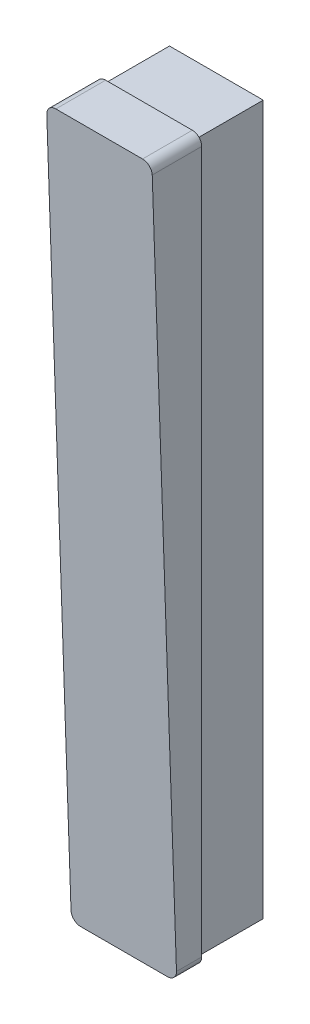
ISO-10303-21;
HEADER;
FILE_DESCRIPTION(('STEP AP214'),'2;1');
FILE_NAME('part.step','',(''),(''),'','','');
FILE_SCHEMA(('AUTOMOTIVE_DESIGN { 1 0 10303 214 1 1 1 1 }'));
ENDSEC;
DATA;
#1=APPLICATION_CONTEXT('core data for automotive mechanical design processes');
#2=APPLICATION_PROTOCOL_DEFINITION('international standard','automotive_design',2000,#1);
#3=PRODUCT_CONTEXT('',#1,'mechanical');
#4=PRODUCT('Part','Part','',(#3));
#5=PRODUCT_RELATED_PRODUCT_CATEGORY('part','',(#4));
#6=PRODUCT_DEFINITION_FORMATION('','',#4);
#7=PRODUCT_DEFINITION_CONTEXT('part definition',#1,'design');
#8=PRODUCT_DEFINITION('design','',#6,#7);
#9=PRODUCT_DEFINITION_SHAPE('','',#8);
#10=(LENGTH_UNIT() NAMED_UNIT(*) SI_UNIT(.MILLI.,.METRE.));
#11=(NAMED_UNIT(*) PLANE_ANGLE_UNIT() SI_UNIT($,.RADIAN.));
#12=(NAMED_UNIT(*) SI_UNIT($,.STERADIAN.) SOLID_ANGLE_UNIT());
#13=UNCERTAINTY_MEASURE_WITH_UNIT(LENGTH_MEASURE(1.E-05),#10,'distance_accuracy_value','');
#14=(GEOMETRIC_REPRESENTATION_CONTEXT(3) GLOBAL_UNCERTAINTY_ASSIGNED_CONTEXT((#13)) GLOBAL_UNIT_ASSIGNED_CONTEXT((#10,
#11,#12)) REPRESENTATION_CONTEXT('',''));
#15=CARTESIAN_POINT('',(0.,0.,0.));
#16=DIRECTION('',(0.,0.,1.));
#17=DIRECTION('',(1.,0.,0.));
#18=AXIS2_PLACEMENT_3D('',#15,#16,#17);
#19=CARTESIAN_POINT('',(28.575,195.2625,0.));
#20=DIRECTION('',(0.,0.,-1.));
#21=DIRECTION('',(-1.,0.,0.));
#22=AXIS2_PLACEMENT_3D('',#19,#20,#21);
#23=PLANE('',#22);
#24=DIRECTION('',(0.,-1.,0.));
#25=VECTOR('',#24,1.);
#26=CARTESIAN_POINT('',(-28.575,195.2625,0.));
#27=LINE('',#26,#25);
#28=CARTESIAN_POINT('',(-28.575,190.1825,0.));
#29=VERTEX_POINT('',#28);
#30=CARTESIAN_POINT('',(-28.575,-190.1825,0.));
#31=VERTEX_POINT('',#30);
#32=EDGE_CURVE('E207',#29,#31,#27,.T.);
#33=ORIENTED_EDGE('',*,*,#32,.F.);
#34=CARTESIAN_POINT('',(-23.495,190.1825,0.));
#35=DIRECTION('',(0.,0.,-1.));
#36=DIRECTION('',(-1.,0.,0.));
#37=AXIS2_PLACEMENT_3D('',#34,#35,#36);
#38=CIRCLE('',#37,5.08);
#39=CARTESIAN_POINT('',(-23.495,195.2625,0.));
#40=VERTEX_POINT('',#39);
#41=EDGE_CURVE('E238',#29,#40,#38,.T.);
#42=ORIENTED_EDGE('',*,*,#41,.T.);
#43=DIRECTION('',(-1.,0.,0.));
#44=VECTOR('',#43,1.);
#45=CARTESIAN_POINT('',(28.575,195.2625,0.));
#46=LINE('',#45,#44);
#47=CARTESIAN_POINT('',(23.495,195.2625,0.));
#48=VERTEX_POINT('',#47);
#49=EDGE_CURVE('E219',#48,#40,#46,.T.);
#50=ORIENTED_EDGE('',*,*,#49,.F.);
#51=CARTESIAN_POINT('',(23.495,190.1825,0.));
#52=DIRECTION('',(0.,0.,-1.));
#53=DIRECTION('',(-1.,0.,0.));
#54=AXIS2_PLACEMENT_3D('',#51,#52,#53);
#55=CIRCLE('',#54,5.08);
#56=CARTESIAN_POINT('',(28.575,190.1825,0.));
#57=VERTEX_POINT('',#56);
#58=EDGE_CURVE('E234',#48,#57,#55,.T.);
#59=ORIENTED_EDGE('',*,*,#58,.T.);
#60=DIRECTION('',(0.,-1.,0.));
#61=VECTOR('',#60,1.);
#62=CARTESIAN_POINT('',(28.575,195.2625,0.));
#63=LINE('',#62,#61);
#64=CARTESIAN_POINT('',(28.575,-190.1825,0.));
#65=VERTEX_POINT('',#64);
#66=EDGE_CURVE('E206',#57,#65,#63,.T.);
#67=ORIENTED_EDGE('',*,*,#66,.T.);
#68=CARTESIAN_POINT('',(23.495,-190.1825,0.));
#69=DIRECTION('',(0.,0.,-1.));
#70=DIRECTION('',(-1.,0.,0.));
#71=AXIS2_PLACEMENT_3D('',#68,#69,#70);
#72=CIRCLE('',#71,5.08);
#73=CARTESIAN_POINT('',(23.495,-195.2625,0.));
#74=VERTEX_POINT('',#73);
#75=EDGE_CURVE('E232',#65,#74,#72,.T.);
#76=ORIENTED_EDGE('',*,*,#75,.T.);
#77=DIRECTION('',(-1.,0.,0.));
#78=VECTOR('',#77,1.);
#79=CARTESIAN_POINT('',(28.575,-195.2625,0.));
#80=LINE('',#79,#78);
#81=CARTESIAN_POINT('',(-23.495,-195.2625,0.));
#82=VERTEX_POINT('',#81);
#83=EDGE_CURVE('E215',#74,#82,#80,.T.);
#84=ORIENTED_EDGE('',*,*,#83,.T.);
#85=CARTESIAN_POINT('',(-23.495,-190.1825,0.));
#86=DIRECTION('',(0.,0.,-1.));
#87=DIRECTION('',(-1.,0.,0.));
#88=AXIS2_PLACEMENT_3D('',#85,#86,#87);
#89=CIRCLE('',#88,5.08);
#90=EDGE_CURVE('E236',#82,#31,#89,.T.);
#91=ORIENTED_EDGE('',*,*,#90,.T.);
#92=EDGE_LOOP('',(#33,#42,#50,#59,#67,#76,#84,#91));
#93=FACE_BOUND('',#92,.T.);
#94=DIRECTION('',(1.,0.,0.));
#95=VECTOR('',#94,1.);
#96=CARTESIAN_POINT('',(25.4,192.0875,0.));
#97=LINE('',#96,#95);
#98=CARTESIAN_POINT('',(-25.4,192.0875,0.));
#99=VERTEX_POINT('',#98);
#100=CARTESIAN_POINT('',(25.4,192.0875,0.));
#101=VERTEX_POINT('',#100);
#102=EDGE_CURVE('E188',#99,#101,#97,.T.);
#103=ORIENTED_EDGE('',*,*,#102,.F.);
#104=DIRECTION('',(0.,1.,0.));
#105=VECTOR('',#104,1.);
#106=CARTESIAN_POINT('',(-25.4,192.0875,0.));
#107=LINE('',#106,#105);
#108=CARTESIAN_POINT('',(-25.4,-192.0875,0.));
#109=VERTEX_POINT('',#108);
#110=EDGE_CURVE('E174',#109,#99,#107,.T.);
#111=ORIENTED_EDGE('',*,*,#110,.F.);
#112=DIRECTION('',(-1.,0.,0.));
#113=VECTOR('',#112,1.);
#114=CARTESIAN_POINT('',(-25.4,-192.0875,0.));
#115=LINE('',#114,#113);
#116=CARTESIAN_POINT('',(25.4,-192.0875,0.));
#117=VERTEX_POINT('',#116);
#118=EDGE_CURVE('E179',#117,#109,#115,.T.);
#119=ORIENTED_EDGE('',*,*,#118,.F.);
#120=DIRECTION('',(0.,-1.,0.));
#121=VECTOR('',#120,1.);
#122=CARTESIAN_POINT('',(25.4,-192.0875,0.));
#123=LINE('',#122,#121);
#124=EDGE_CURVE('E190',#101,#117,#123,.T.);
#125=ORIENTED_EDGE('',*,*,#124,.F.);
#126=EDGE_LOOP('',(#103,#111,#119,#125));
#127=FACE_BOUND('',#126,.T.);
#128=ADVANCED_FACE('F35',(#93,#127),#23,.T.);
#129=CARTESIAN_POINT('',(28.575,-195.2625,0.));
#130=DIRECTION('',(0.,-1.,0.));
#131=DIRECTION('',(0.,0.,-1.));
#132=AXIS2_PLACEMENT_3D('',#129,#130,#131);
#133=PLANE('',#132);
#134=DIRECTION('',(-1.,0.,0.));
#135=VECTOR('',#134,1.);
#136=CARTESIAN_POINT('',(28.575,-195.2625,13.49375));
#137=LINE('',#136,#135);
#138=CARTESIAN_POINT('',(23.495,-195.2625,13.49375));
#139=VERTEX_POINT('',#138);
#140=CARTESIAN_POINT('',(-23.495,-195.2625,13.49375));
#141=VERTEX_POINT('',#140);
#142=EDGE_CURVE('E210',#139,#141,#137,.T.);
#143=ORIENTED_EDGE('',*,*,#142,.T.);
#144=DIRECTION('',(0.,0.,1.));
#145=VECTOR('',#144,1.);
#146=CARTESIAN_POINT('',(-23.495,-195.2625,0.));
#147=LINE('',#146,#145);
#148=EDGE_CURVE('E255',#141,#82,#147,.F.);
#149=ORIENTED_EDGE('',*,*,#148,.T.);
#150=ORIENTED_EDGE('',*,*,#83,.F.);
#151=DIRECTION('',(0.,0.,1.));
#152=VECTOR('',#151,1.);
#153=CARTESIAN_POINT('',(23.495,-195.2625,0.));
#154=LINE('',#153,#152);
#155=EDGE_CURVE('E252',#74,#139,#154,.T.);
#156=ORIENTED_EDGE('',*,*,#155,.T.);
#157=EDGE_LOOP('',(#143,#149,#150,#156));
#158=FACE_BOUND('',#157,.T.);
#159=ADVANCED_FACE('F267',(#158),#133,.T.);
#160=CARTESIAN_POINT('',(28.575,195.2625,26.9875));
#161=DIRECTION('',(0.,1.,0.));
#162=DIRECTION('',(0.,0.,1.));
#163=AXIS2_PLACEMENT_3D('',#160,#161,#162);
#164=PLANE('',#163);
#165=ORIENTED_EDGE('',*,*,#49,.T.);
#166=DIRECTION('',(0.,0.,-1.));
#167=VECTOR('',#166,1.);
#168=CARTESIAN_POINT('',(-23.495,195.2625,26.9875));
#169=LINE('',#168,#167);
#170=CARTESIAN_POINT('',(-23.495,195.2625,26.9875));
#171=VERTEX_POINT('',#170);
#172=EDGE_CURVE('E243',#40,#171,#169,.F.);
#173=ORIENTED_EDGE('',*,*,#172,.T.);
#174=DIRECTION('',(-1.,0.,0.));
#175=VECTOR('',#174,1.);
#176=CARTESIAN_POINT('',(28.575,195.2625,26.9875));
#177=LINE('',#176,#175);
#178=CARTESIAN_POINT('',(23.495,195.2625,26.9875));
#179=VERTEX_POINT('',#178);
#180=EDGE_CURVE('E222',#179,#171,#177,.T.);
#181=ORIENTED_EDGE('',*,*,#180,.F.);
#182=DIRECTION('',(0.,0.,-1.));
#183=VECTOR('',#182,1.);
#184=CARTESIAN_POINT('',(23.495,195.2625,26.9875));
#185=LINE('',#184,#183);
#186=EDGE_CURVE('E240',#179,#48,#185,.T.);
#187=ORIENTED_EDGE('',*,*,#186,.T.);
#188=EDGE_LOOP('',(#165,#173,#181,#187));
#189=FACE_BOUND('',#188,.T.);
#190=ADVANCED_FACE('F281',(#189),#164,.T.);
#191=CARTESIAN_POINT('',(28.575,-195.2625,13.49375));
#192=DIRECTION('',(0.,-0.0345322376732171,0.999403584424871));
#193=DIRECTION('',(0.,-0.999403584424871,-0.0345322376732171));
#194=AXIS2_PLACEMENT_3D('',#191,#192,#193);
#195=PLANE('',#194);
#196=ORIENTED_EDGE('',*,*,#180,.T.);
#197=CARTESIAN_POINT('',(-23.495,190.1825,26.8119715447154));
#198=DIRECTION('',(0.,-0.0345322376732171,0.999403584424871));
#199=DIRECTION('',(0.,0.999403584424871,0.0345322376732171));
#200=AXIS2_PLACEMENT_3D('',#197,#198,#199);
#201=ELLIPSE('',#200,5.08303159921464,5.08);
#202=CARTESIAN_POINT('',(-28.575,190.1825,26.8119715447154));
#203=VERTEX_POINT('',#202);
#204=EDGE_CURVE('E250',#171,#203,#201,.T.);
#205=ORIENTED_EDGE('',*,*,#204,.T.);
#206=DIRECTION('',(0.,0.999403584424871,0.0345322376732171));
#207=VECTOR('',#206,1.);
#208=CARTESIAN_POINT('',(-28.575,-195.2625,13.49375));
#209=LINE('',#208,#207);
#210=CARTESIAN_POINT('',(-28.575,-190.1825,13.6692784552845));
#211=VERTEX_POINT('',#210);
#212=EDGE_CURVE('E203',#211,#203,#209,.T.);
#213=ORIENTED_EDGE('',*,*,#212,.F.);
#214=CARTESIAN_POINT('',(-23.495,-190.1825,13.6692784552845));
#215=DIRECTION('',(0.,-0.0345322376732171,0.999403584424871));
#216=DIRECTION('',(0.,-0.999403584424871,-0.0345322376732171));
#217=AXIS2_PLACEMENT_3D('',#214,#215,#216);
#218=ELLIPSE('',#217,5.08303159921464,5.08);
#219=EDGE_CURVE('E248',#211,#141,#218,.T.);
#220=ORIENTED_EDGE('',*,*,#219,.T.);
#221=ORIENTED_EDGE('',*,*,#142,.F.);
#222=CARTESIAN_POINT('',(23.495,-190.1825,13.6692784552845));
#223=DIRECTION('',(0.,-0.0345322376732171,0.999403584424871));
#224=DIRECTION('',(0.,0.999403584424871,0.0345322376732171));
#225=AXIS2_PLACEMENT_3D('',#222,#223,#224);
#226=ELLIPSE('',#225,5.08303159921464,5.08);
#227=CARTESIAN_POINT('',(28.575,-190.1825,13.6692784552845));
#228=VERTEX_POINT('',#227);
#229=EDGE_CURVE('E55',#139,#228,#226,.T.);
#230=ORIENTED_EDGE('',*,*,#229,.T.);
#231=DIRECTION('',(0.,0.999403584424871,0.0345322376732171));
#232=VECTOR('',#231,1.);
#233=CARTESIAN_POINT('',(28.575,-195.2625,13.49375));
#234=LINE('',#233,#232);
#235=CARTESIAN_POINT('',(28.575,190.1825,26.8119715447154));
#236=VERTEX_POINT('',#235);
#237=EDGE_CURVE('E204',#228,#236,#234,.T.);
#238=ORIENTED_EDGE('',*,*,#237,.T.);
#239=CARTESIAN_POINT('',(23.495,190.1825,26.8119715447154));
#240=DIRECTION('',(0.,-0.0345322376732171,0.999403584424871));
#241=DIRECTION('',(0.,-0.999403584424871,-0.0345322376732171));
#242=AXIS2_PLACEMENT_3D('',#239,#240,#241);
#243=ELLIPSE('',#242,5.08303159921464,5.08);
#244=EDGE_CURVE('E246',#236,#179,#243,.T.);
#245=ORIENTED_EDGE('',*,*,#244,.T.);
#246=EDGE_LOOP('',(#196,#205,#213,#220,#221,#230,#238,#245));
#247=FACE_BOUND('',#246,.T.);
#248=ADVANCED_FACE('F269',(#247),#195,.T.);
#249=CARTESIAN_POINT('',(28.575,0.,0.));
#250=DIRECTION('',(1.,0.,0.));
#251=DIRECTION('',(0.,0.,-1.));
#252=AXIS2_PLACEMENT_3D('',#249,#250,#251);
#253=PLANE('',#252);
#254=ORIENTED_EDGE('',*,*,#66,.F.);
#255=DIRECTION('',(0.,0.,-1.));
#256=VECTOR('',#255,1.);
#257=CARTESIAN_POINT('',(28.575,190.1825,0.));
#258=LINE('',#257,#256);
#259=EDGE_CURVE('E11',#57,#236,#258,.F.);
#260=ORIENTED_EDGE('',*,*,#259,.T.);
#261=ORIENTED_EDGE('',*,*,#237,.F.);
#262=DIRECTION('',(0.,0.,1.));
#263=VECTOR('',#262,1.);
#264=CARTESIAN_POINT('',(28.575,-190.1825,0.));
#265=LINE('',#264,#263);
#266=EDGE_CURVE('E43',#228,#65,#265,.F.);
#267=ORIENTED_EDGE('',*,*,#266,.T.);
#268=EDGE_LOOP('',(#254,#260,#261,#267));
#269=FACE_BOUND('',#268,.T.);
#270=ADVANCED_FACE('F257',(#269),#253,.T.);
#271=CARTESIAN_POINT('',(-28.575,0.,0.));
#272=DIRECTION('',(1.,0.,0.));
#273=DIRECTION('',(0.,0.,-1.));
#274=AXIS2_PLACEMENT_3D('',#271,#272,#273);
#275=PLANE('',#274);
#276=ORIENTED_EDGE('',*,*,#212,.T.);
#277=DIRECTION('',(0.,0.,-1.));
#278=VECTOR('',#277,1.);
#279=CARTESIAN_POINT('',(-28.575,190.1825,0.));
#280=LINE('',#279,#278);
#281=EDGE_CURVE('E229',#203,#29,#280,.T.);
#282=ORIENTED_EDGE('',*,*,#281,.T.);
#283=ORIENTED_EDGE('',*,*,#32,.T.);
#284=DIRECTION('',(0.,0.,1.));
#285=VECTOR('',#284,1.);
#286=CARTESIAN_POINT('',(-28.575,-190.1825,13.49375));
#287=LINE('',#286,#285);
#288=EDGE_CURVE('E218',#31,#211,#287,.T.);
#289=ORIENTED_EDGE('',*,*,#288,.T.);
#290=EDGE_LOOP('',(#276,#282,#283,#289));
#291=FACE_BOUND('',#290,.T.);
#292=ADVANCED_FACE('F276',(#291),#275,.F.);
#293=CARTESIAN_POINT('',(-25.4,192.0875,-36.5125));
#294=DIRECTION('',(1.,0.,0.));
#295=DIRECTION('',(0.,1.,0.));
#296=AXIS2_PLACEMENT_3D('',#293,#294,#295);
#297=PLANE('',#296);
#298=ORIENTED_EDGE('',*,*,#110,.T.);
#299=DIRECTION('',(0.,0.,1.));
#300=VECTOR('',#299,1.);
#301=CARTESIAN_POINT('',(-25.4,192.0875,-36.5125));
#302=LINE('',#301,#300);
#303=CARTESIAN_POINT('',(-25.4,192.0875,-36.5125));
#304=VERTEX_POINT('',#303);
#305=EDGE_CURVE('E201',#304,#99,#302,.T.);
#306=ORIENTED_EDGE('',*,*,#305,.F.);
#307=DIRECTION('',(0.,1.,0.));
#308=VECTOR('',#307,1.);
#309=CARTESIAN_POINT('',(-25.4,192.0875,-36.5125));
#310=LINE('',#309,#308);
#311=CARTESIAN_POINT('',(-25.4,-192.0875,-36.5125));
#312=VERTEX_POINT('',#311);
#313=EDGE_CURVE('E175',#312,#304,#310,.T.);
#314=ORIENTED_EDGE('',*,*,#313,.F.);
#315=DIRECTION('',(0.,0.,1.));
#316=VECTOR('',#315,1.);
#317=CARTESIAN_POINT('',(-25.4,-192.0875,-36.5125));
#318=LINE('',#317,#316);
#319=EDGE_CURVE('E185',#312,#109,#318,.T.);
#320=ORIENTED_EDGE('',*,*,#319,.T.);
#321=EDGE_LOOP('',(#298,#306,#314,#320));
#322=FACE_BOUND('',#321,.T.);
#323=ADVANCED_FACE('F350',(#322),#297,.F.);
#324=CARTESIAN_POINT('',(25.4,192.0875,-36.5125));
#325=DIRECTION('',(0.,-1.,0.));
#326=DIRECTION('',(0.,0.,-1.));
#327=AXIS2_PLACEMENT_3D('',#324,#325,#326);
#328=PLANE('',#327);
#329=ORIENTED_EDGE('',*,*,#102,.T.);
#330=DIRECTION('',(0.,0.,1.));
#331=VECTOR('',#330,1.);
#332=CARTESIAN_POINT('',(25.4,192.0875,-36.5125));
#333=LINE('',#332,#331);
#334=CARTESIAN_POINT('',(25.4,192.0875,-36.5125));
#335=VERTEX_POINT('',#334);
#336=EDGE_CURVE('E198',#335,#101,#333,.T.);
#337=ORIENTED_EDGE('',*,*,#336,.F.);
#338=DIRECTION('',(1.,0.,0.));
#339=VECTOR('',#338,1.);
#340=CARTESIAN_POINT('',(25.4,192.0875,-36.5125));
#341=LINE('',#340,#339);
#342=EDGE_CURVE('E178',#304,#335,#341,.T.);
#343=ORIENTED_EDGE('',*,*,#342,.F.);
#344=ORIENTED_EDGE('',*,*,#305,.T.);
#345=EDGE_LOOP('',(#329,#337,#343,#344));
#346=FACE_BOUND('',#345,.T.);
#347=ADVANCED_FACE('F346',(#346),#328,.F.);
#348=CARTESIAN_POINT('',(25.4,-192.0875,-36.5125));
#349=DIRECTION('',(-1.,0.,0.));
#350=DIRECTION('',(0.,0.,1.));
#351=AXIS2_PLACEMENT_3D('',#348,#349,#350);
#352=PLANE('',#351);
#353=ORIENTED_EDGE('',*,*,#124,.T.);
#354=DIRECTION('',(0.,0.,1.));
#355=VECTOR('',#354,1.);
#356=CARTESIAN_POINT('',(25.4,-192.0875,-36.5125));
#357=LINE('',#356,#355);
#358=CARTESIAN_POINT('',(25.4,-192.0875,-36.5125));
#359=VERTEX_POINT('',#358);
#360=EDGE_CURVE('E196',#359,#117,#357,.T.);
#361=ORIENTED_EDGE('',*,*,#360,.F.);
#362=DIRECTION('',(0.,-1.,0.));
#363=VECTOR('',#362,1.);
#364=CARTESIAN_POINT('',(25.4,-192.0875,-36.5125));
#365=LINE('',#364,#363);
#366=EDGE_CURVE('E181',#335,#359,#365,.T.);
#367=ORIENTED_EDGE('',*,*,#366,.F.);
#368=ORIENTED_EDGE('',*,*,#336,.T.);
#369=EDGE_LOOP('',(#353,#361,#367,#368));
#370=FACE_BOUND('',#369,.T.);
#371=ADVANCED_FACE('F342',(#370),#352,.F.);
#372=CARTESIAN_POINT('',(-25.4,-192.0875,-36.5125));
#373=DIRECTION('',(0.,1.,0.));
#374=DIRECTION('',(0.,0.,1.));
#375=AXIS2_PLACEMENT_3D('',#372,#373,#374);
#376=PLANE('',#375);
#377=ORIENTED_EDGE('',*,*,#118,.T.);
#378=ORIENTED_EDGE('',*,*,#319,.F.);
#379=DIRECTION('',(-1.,0.,0.));
#380=VECTOR('',#379,1.);
#381=CARTESIAN_POINT('',(-25.4,-192.0875,-36.5125));
#382=LINE('',#381,#380);
#383=EDGE_CURVE('E183',#359,#312,#382,.T.);
#384=ORIENTED_EDGE('',*,*,#383,.F.);
#385=ORIENTED_EDGE('',*,*,#360,.T.);
#386=EDGE_LOOP('',(#377,#378,#384,#385));
#387=FACE_BOUND('',#386,.T.);
#388=ADVANCED_FACE('F338',(#387),#376,.F.);
#389=CARTESIAN_POINT('',(0.,0.,-36.5125));
#390=DIRECTION('',(0.,0.,1.));
#391=DIRECTION('',(0.,-1.,0.));
#392=AXIS2_PLACEMENT_3D('',#389,#390,#391);
#393=PLANE('',#392);
#394=CARTESIAN_POINT('',(0.,144.4625,-36.5125));
#395=DIRECTION('',(0.,0.,-1.));
#396=DIRECTION('',(0.,1.,0.));
#397=AXIS2_PLACEMENT_3D('',#394,#395,#396);
#398=CIRCLE('',#397,13.3347714);
#399=CARTESIAN_POINT('',(0.,157.7972714,-36.5125));
#400=VERTEX_POINT('',#399);
#401=EDGE_CURVE('E536',#400,#400,#398,.T.);
#402=ORIENTED_EDGE('',*,*,#401,.F.);
#403=EDGE_LOOP('',(#402));
#404=FACE_BOUND('',#403,.T.);
#405=CARTESIAN_POINT('',(0.,-166.6875,-36.5125));
#406=DIRECTION('',(0.,0.,-1.));
#407=DIRECTION('',(0.,1.,0.));
#408=AXIS2_PLACEMENT_3D('',#405,#406,#407);
#409=CIRCLE('',#408,13.3347714);
#410=CARTESIAN_POINT('',(0.,-153.3527286,-36.5125));
#411=VERTEX_POINT('',#410);
#412=EDGE_CURVE('E143',#411,#411,#409,.T.);
#413=ORIENTED_EDGE('',*,*,#412,.F.);
#414=EDGE_LOOP('',(#413));
#415=FACE_BOUND('',#414,.T.);
#416=CARTESIAN_POINT('',(0.,100.0125,-36.5125));
#417=DIRECTION('',(0.,0.,-1.));
#418=DIRECTION('',(0.,1.,0.));
#419=AXIS2_PLACEMENT_3D('',#416,#417,#418);
#420=CIRCLE('',#419,4.21639999999999);
#421=CARTESIAN_POINT('',(0.,104.2289,-36.5125));
#422=VERTEX_POINT('',#421);
#423=EDGE_CURVE('E162',#422,#422,#420,.T.);
#424=ORIENTED_EDGE('',*,*,#423,.F.);
#425=EDGE_LOOP('',(#424));
#426=FACE_BOUND('',#425,.T.);
#427=CARTESIAN_POINT('',(0.,-122.2375,-36.5125));
#428=DIRECTION('',(0.,0.,-1.));
#429=DIRECTION('',(0.,1.,0.));
#430=AXIS2_PLACEMENT_3D('',#427,#428,#429);
#431=CIRCLE('',#430,4.21639999999999);
#432=CARTESIAN_POINT('',(0.,-118.0211,-36.5125));
#433=VERTEX_POINT('',#432);
#434=EDGE_CURVE('E168',#433,#433,#431,.T.);
#435=ORIENTED_EDGE('',*,*,#434,.F.);
#436=EDGE_LOOP('',(#435));
#437=FACE_BOUND('',#436,.T.);
#438=ORIENTED_EDGE('',*,*,#313,.T.);
#439=ORIENTED_EDGE('',*,*,#342,.T.);
#440=ORIENTED_EDGE('',*,*,#366,.T.);
#441=ORIENTED_EDGE('',*,*,#383,.T.);
#442=EDGE_LOOP('',(#438,#439,#440,#441));
#443=FACE_BOUND('',#442,.T.);
#444=ADVANCED_FACE('F334',(#404,#415,#426,#437,#443),#393,.F.);
#445=CARTESIAN_POINT('',(0.,-122.2375,-12.1539));
#446=DIRECTION('',(0.,0.,-1.));
#447=DIRECTION('',(0.,1.,0.));
#448=AXIS2_PLACEMENT_3D('',#445,#446,#447);
#449=CONICAL_SURFACE('',#448,4.21639999999999,1.02974425866655);
#450=CARTESIAN_POINT('',(0.,-122.2375,-9.62043128587429));
#451=VERTEX_POINT('',#450);
#452=VERTEX_LOOP('',#451);
#453=FACE_BOUND('',#452,.T.);
#454=CARTESIAN_POINT('',(0.,-122.2375,-12.1539));
#455=DIRECTION('',(0.,0.,-1.));
#456=DIRECTION('',(0.,1.,0.));
#457=AXIS2_PLACEMENT_3D('',#454,#455,#456);
#458=CIRCLE('',#457,4.21639999999999);
#459=CARTESIAN_POINT('',(0.,-118.0211,-12.1539));
#460=VERTEX_POINT('',#459);
#461=EDGE_CURVE('E171',#460,#460,#458,.T.);
#462=ORIENTED_EDGE('',*,*,#461,.T.);
#463=EDGE_LOOP('',(#462));
#464=FACE_BOUND('',#463,.T.);
#465=ADVANCED_FACE('F330',(#453,#464),#449,.F.);
#466=CARTESIAN_POINT('',(0.,-122.2375,-36.5125));
#467=DIRECTION('',(0.,0.,-1.));
#468=DIRECTION('',(0.,1.,0.));
#469=AXIS2_PLACEMENT_3D('',#466,#467,#468);
#470=CYLINDRICAL_SURFACE('',#469,4.21639999999999);
#471=ORIENTED_EDGE('',*,*,#461,.F.);
#472=EDGE_LOOP('',(#471));
#473=FACE_BOUND('',#472,.T.);
#474=ORIENTED_EDGE('',*,*,#434,.T.);
#475=EDGE_LOOP('',(#474));
#476=FACE_BOUND('',#475,.T.);
#477=ADVANCED_FACE('F320',(#473,#476),#470,.F.);
#478=CARTESIAN_POINT('',(0.,100.0125,-12.1539));
#479=DIRECTION('',(0.,0.,-1.));
#480=DIRECTION('',(0.,1.,0.));
#481=AXIS2_PLACEMENT_3D('',#478,#479,#480);
#482=CONICAL_SURFACE('',#481,4.21639999999999,1.02974425866655);
#483=CARTESIAN_POINT('',(0.,100.0125,-9.62043128587429));
#484=VERTEX_POINT('',#483);
#485=VERTEX_LOOP('',#484);
#486=FACE_BOUND('',#485,.T.);
#487=CARTESIAN_POINT('',(0.,100.0125,-12.1539));
#488=DIRECTION('',(0.,0.,-1.));
#489=DIRECTION('',(0.,1.,0.));
#490=AXIS2_PLACEMENT_3D('',#487,#488,#489);
#491=CIRCLE('',#490,4.21639999999999);
#492=CARTESIAN_POINT('',(0.,104.2289,-12.1539));
#493=VERTEX_POINT('',#492);
#494=EDGE_CURVE('E165',#493,#493,#491,.T.);
#495=ORIENTED_EDGE('',*,*,#494,.T.);
#496=EDGE_LOOP('',(#495));
#497=FACE_BOUND('',#496,.T.);
#498=ADVANCED_FACE('F314',(#486,#497),#482,.F.);
#499=CARTESIAN_POINT('',(0.,100.0125,-36.5125));
#500=DIRECTION('',(0.,0.,-1.));
#501=DIRECTION('',(0.,1.,0.));
#502=AXIS2_PLACEMENT_3D('',#499,#500,#501);
#503=CYLINDRICAL_SURFACE('',#502,4.21639999999999);
#504=ORIENTED_EDGE('',*,*,#494,.F.);
#505=EDGE_LOOP('',(#504));
#506=FACE_BOUND('',#505,.T.);
#507=ORIENTED_EDGE('',*,*,#423,.T.);
#508=EDGE_LOOP('',(#507));
#509=FACE_BOUND('',#508,.T.);
#510=ADVANCED_FACE('F310',(#506,#509),#503,.F.);
#511=CARTESIAN_POINT('',(-23.495,190.1825,0.));
#512=DIRECTION('',(0.,0.,1.));
#513=DIRECTION('',(1.,0.,0.));
#514=AXIS2_PLACEMENT_3D('',#511,#512,#513);
#515=CYLINDRICAL_SURFACE('',#514,5.08);
#516=ORIENTED_EDGE('',*,*,#204,.F.);
#517=ORIENTED_EDGE('',*,*,#172,.F.);
#518=ORIENTED_EDGE('',*,*,#41,.F.);
#519=ORIENTED_EDGE('',*,*,#281,.F.);
#520=EDGE_LOOP('',(#516,#517,#518,#519));
#521=FACE_BOUND('',#520,.T.);
#522=ADVANCED_FACE('F285',(#521),#515,.T.);
#523=CARTESIAN_POINT('',(-23.495,-190.1825,0.));
#524=DIRECTION('',(0.,0.,-1.));
#525=DIRECTION('',(-1.,0.,0.));
#526=AXIS2_PLACEMENT_3D('',#523,#524,#525);
#527=CYLINDRICAL_SURFACE('',#526,5.08);
#528=ORIENTED_EDGE('',*,*,#90,.F.);
#529=ORIENTED_EDGE('',*,*,#148,.F.);
#530=ORIENTED_EDGE('',*,*,#219,.F.);
#531=ORIENTED_EDGE('',*,*,#288,.F.);
#532=EDGE_LOOP('',(#528,#529,#530,#531));
#533=FACE_BOUND('',#532,.T.);
#534=ADVANCED_FACE('F274',(#533),#527,.T.);
#535=CARTESIAN_POINT('',(23.495,190.1825,26.9875));
#536=DIRECTION('',(0.,0.,-1.));
#537=DIRECTION('',(-1.,0.,0.));
#538=AXIS2_PLACEMENT_3D('',#535,#536,#537);
#539=CYLINDRICAL_SURFACE('',#538,5.08);
#540=ORIENTED_EDGE('',*,*,#244,.F.);
#541=ORIENTED_EDGE('',*,*,#259,.F.);
#542=ORIENTED_EDGE('',*,*,#58,.F.);
#543=ORIENTED_EDGE('',*,*,#186,.F.);
#544=EDGE_LOOP('',(#540,#541,#542,#543));
#545=FACE_BOUND('',#544,.T.);
#546=ADVANCED_FACE('F288',(#545),#539,.T.);
#547=CARTESIAN_POINT('',(23.495,-190.1825,0.));
#548=DIRECTION('',(0.,0.,1.));
#549=DIRECTION('',(1.,0.,0.));
#550=AXIS2_PLACEMENT_3D('',#547,#548,#549);
#551=CYLINDRICAL_SURFACE('',#550,5.08);
#552=ORIENTED_EDGE('',*,*,#75,.F.);
#553=ORIENTED_EDGE('',*,*,#266,.F.);
#554=ORIENTED_EDGE('',*,*,#229,.F.);
#555=ORIENTED_EDGE('',*,*,#155,.F.);
#556=EDGE_LOOP('',(#552,#553,#554,#555));
#557=FACE_BOUND('',#556,.T.);
#558=ADVANCED_FACE('F37',(#557),#551,.T.);
#559=CARTESIAN_POINT('',(0.,-166.6875,-13.3985000000001));
#560=DIRECTION('',(0.,0.,-1.));
#561=DIRECTION('',(0.,1.,0.));
#562=AXIS2_PLACEMENT_3D('',#559,#560,#561);
#563=CONICAL_SURFACE('',#562,11.5062,1.02974425867665);
#564=CARTESIAN_POINT('',(0.,-166.6875,-6.48487754534513));
#565=VERTEX_POINT('',#564);
#566=VERTEX_LOOP('',#565);
#567=FACE_BOUND('',#566,.T.);
#568=CARTESIAN_POINT('',(0.,-166.6875,-13.3985000000001));
#569=DIRECTION('',(0.,0.,-1.));
#570=DIRECTION('',(0.,1.,0.));
#571=AXIS2_PLACEMENT_3D('',#568,#569,#570);
#572=CIRCLE('',#571,11.5062);
#573=CARTESIAN_POINT('',(0.,-155.1813,-13.3985000000001));
#574=VERTEX_POINT('',#573);
#575=EDGE_CURVE('E159',#574,#574,#572,.T.);
#576=ORIENTED_EDGE('',*,*,#575,.T.);
#577=EDGE_LOOP('',(#576));
#578=FACE_BOUND('',#577,.T.);
#579=ADVANCED_FACE('F294',(#567,#578),#563,.F.);
#580=CARTESIAN_POINT('',(0.,-166.6875,-36.5125));
#581=DIRECTION('',(0.,0.,-1.));
#582=DIRECTION('',(0.,1.,0.));
#583=AXIS2_PLACEMENT_3D('',#580,#581,#582);
#584=CYLINDRICAL_SURFACE('',#583,11.5062);
#585=ORIENTED_EDGE('',*,*,#575,.F.);
#586=EDGE_LOOP('',(#585));
#587=FACE_BOUND('',#586,.T.);
#588=CARTESIAN_POINT('',(0.,-166.6875,-22.4663));
#589=DIRECTION('',(0.,0.,-1.));
#590=DIRECTION('',(0.,1.,0.));
#591=AXIS2_PLACEMENT_3D('',#588,#589,#590);
#592=CIRCLE('',#591,11.5062);
#593=CARTESIAN_POINT('',(0.,-155.1813,-22.4663));
#594=VERTEX_POINT('',#593);
#595=EDGE_CURVE('E156',#594,#594,#592,.T.);
#596=ORIENTED_EDGE('',*,*,#595,.T.);
#597=EDGE_LOOP('',(#596));
#598=FACE_BOUND('',#597,.T.);
#599=ADVANCED_FACE('F466',(#587,#598),#584,.F.);
#600=CARTESIAN_POINT('',(11.5062,-166.6875,-22.4663));
#601=DIRECTION('',(0.,0.,1.));
#602=DIRECTION('',(0.,-1.,0.));
#603=AXIS2_PLACEMENT_3D('',#600,#601,#602);
#604=PLANE('',#603);
#605=ORIENTED_EDGE('',*,*,#595,.F.);
#606=EDGE_LOOP('',(#605));
#607=FACE_BOUND('',#606,.T.);
#608=CARTESIAN_POINT('',(0.,-166.6875,-22.4663));
#609=DIRECTION('',(0.,0.,-1.));
#610=DIRECTION('',(0.,1.,0.));
#611=AXIS2_PLACEMENT_3D('',#608,#609,#610);
#612=CIRCLE('',#611,12.9142093617429);
#613=CARTESIAN_POINT('',(0.,-153.773290638257,-22.4663));
#614=VERTEX_POINT('',#613);
#615=EDGE_CURVE('E147',#614,#614,#612,.T.);
#616=ORIENTED_EDGE('',*,*,#615,.T.);
#617=EDGE_LOOP('',(#616));
#618=FACE_BOUND('',#617,.T.);
#619=ADVANCED_FACE('F474',(#607,#618),#604,.F.);
#620=CARTESIAN_POINT('',(0.,-166.6875,-36.5125));
#621=DIRECTION('',(0.,0.,-1.));
#622=DIRECTION('',(0.,1.,0.));
#623=AXIS2_PLACEMENT_3D('',#620,#621,#622);
#624=CONICAL_SURFACE('',#623,13.3347714,0.0299323966717025);
#625=ORIENTED_EDGE('',*,*,#615,.F.);
#626=EDGE_LOOP('',(#625));
#627=FACE_BOUND('',#626,.T.);
#628=ORIENTED_EDGE('',*,*,#412,.T.);
#629=EDGE_LOOP('',(#628));
#630=FACE_BOUND('',#629,.T.);
#631=ADVANCED_FACE('F137',(#627,#630),#624,.F.);
#632=CARTESIAN_POINT('',(0.,144.4625,-13.3985000000001));
#633=DIRECTION('',(0.,0.,-1.));
#634=DIRECTION('',(0.,1.,0.));
#635=AXIS2_PLACEMENT_3D('',#632,#633,#634);
#636=CONICAL_SURFACE('',#635,11.5062,1.02974425867665);
#637=CARTESIAN_POINT('',(0.,144.4625,-6.48487754534513));
#638=VERTEX_POINT('',#637);
#639=VERTEX_LOOP('',#638);
#640=FACE_BOUND('',#639,.T.);
#641=CARTESIAN_POINT('',(0.,144.4625,-13.3985000000001));
#642=DIRECTION('',(0.,0.,-1.));
#643=DIRECTION('',(0.,1.,0.));
#644=AXIS2_PLACEMENT_3D('',#641,#642,#643);
#645=CIRCLE('',#644,11.5062);
#646=CARTESIAN_POINT('',(0.,155.9687,-13.3985000000001));
#647=VERTEX_POINT('',#646);
#648=EDGE_CURVE('E141',#647,#647,#645,.T.);
#649=ORIENTED_EDGE('',*,*,#648,.T.);
#650=EDGE_LOOP('',(#649));
#651=FACE_BOUND('',#650,.T.);
#652=ADVANCED_FACE('F133',(#640,#651),#636,.F.);
#653=CARTESIAN_POINT('',(0.,144.4625,-36.5125));
#654=DIRECTION('',(0.,0.,-1.));
#655=DIRECTION('',(0.,1.,0.));
#656=AXIS2_PLACEMENT_3D('',#653,#654,#655);
#657=CYLINDRICAL_SURFACE('',#656,11.5062);
#658=ORIENTED_EDGE('',*,*,#648,.F.);
#659=EDGE_LOOP('',(#658));
#660=FACE_BOUND('',#659,.T.);
#661=CARTESIAN_POINT('',(0.,144.4625,-22.4663));
#662=DIRECTION('',(0.,0.,-1.));
#663=DIRECTION('',(0.,1.,0.));
#664=AXIS2_PLACEMENT_3D('',#661,#662,#663);
#665=CIRCLE('',#664,11.5062);
#666=CARTESIAN_POINT('',(0.,155.9687,-22.4663));
#667=VERTEX_POINT('',#666);
#668=EDGE_CURVE('E144',#667,#667,#665,.T.);
#669=ORIENTED_EDGE('',*,*,#668,.T.);
#670=EDGE_LOOP('',(#669));
#671=FACE_BOUND('',#670,.T.);
#672=ADVANCED_FACE('F136',(#660,#671),#657,.F.);
#673=CARTESIAN_POINT('',(11.5062,144.4625,-22.4663));
#674=DIRECTION('',(0.,0.,1.));
#675=DIRECTION('',(0.,-1.,0.));
#676=AXIS2_PLACEMENT_3D('',#673,#674,#675);
#677=PLANE('',#676);
#678=ORIENTED_EDGE('',*,*,#668,.F.);
#679=EDGE_LOOP('',(#678));
#680=FACE_BOUND('',#679,.T.);
#681=CARTESIAN_POINT('',(0.,144.4625,-22.4663));
#682=DIRECTION('',(0.,0.,-1.));
#683=DIRECTION('',(0.,1.,0.));
#684=AXIS2_PLACEMENT_3D('',#681,#682,#683);
#685=CIRCLE('',#684,12.9142093617429);
#686=CARTESIAN_POINT('',(0.,157.376709361743,-22.4663));
#687=VERTEX_POINT('',#686);
#688=EDGE_CURVE('E150',#687,#687,#685,.T.);
#689=ORIENTED_EDGE('',*,*,#688,.T.);
#690=EDGE_LOOP('',(#689));
#691=FACE_BOUND('',#690,.T.);
#692=ADVANCED_FACE('F503',(#680,#691),#677,.F.);
#693=CARTESIAN_POINT('',(0.,144.4625,-36.5125));
#694=DIRECTION('',(0.,0.,-1.));
#695=DIRECTION('',(0.,1.,0.));
#696=AXIS2_PLACEMENT_3D('',#693,#694,#695);
#697=CONICAL_SURFACE('',#696,13.3347714,0.0299323966717025);
#698=ORIENTED_EDGE('',*,*,#688,.F.);
#699=EDGE_LOOP('',(#698));
#700=FACE_BOUND('',#699,.T.);
#701=ORIENTED_EDGE('',*,*,#401,.T.);
#702=EDGE_LOOP('',(#701));
#703=FACE_BOUND('',#702,.T.);
#704=ADVANCED_FACE('F511',(#700,#703),#697,.F.);
#705=CLOSED_SHELL('',(#128,#159,#190,#248,#270,#292,#323,#347,#371,#388,#444,#465,#477,#498,
#510,#522,#534,#546,#558,#579,#599,#619,#631,#652,#672,#692,#704));
#706=MANIFOLD_SOLID_BREP('B2',#705);
#707=ADVANCED_BREP_SHAPE_REPRESENTATION('',(#18,#706),#14);
#708=SHAPE_DEFINITION_REPRESENTATION(#9,#707);
ENDSEC;
END-ISO-10303-21;
